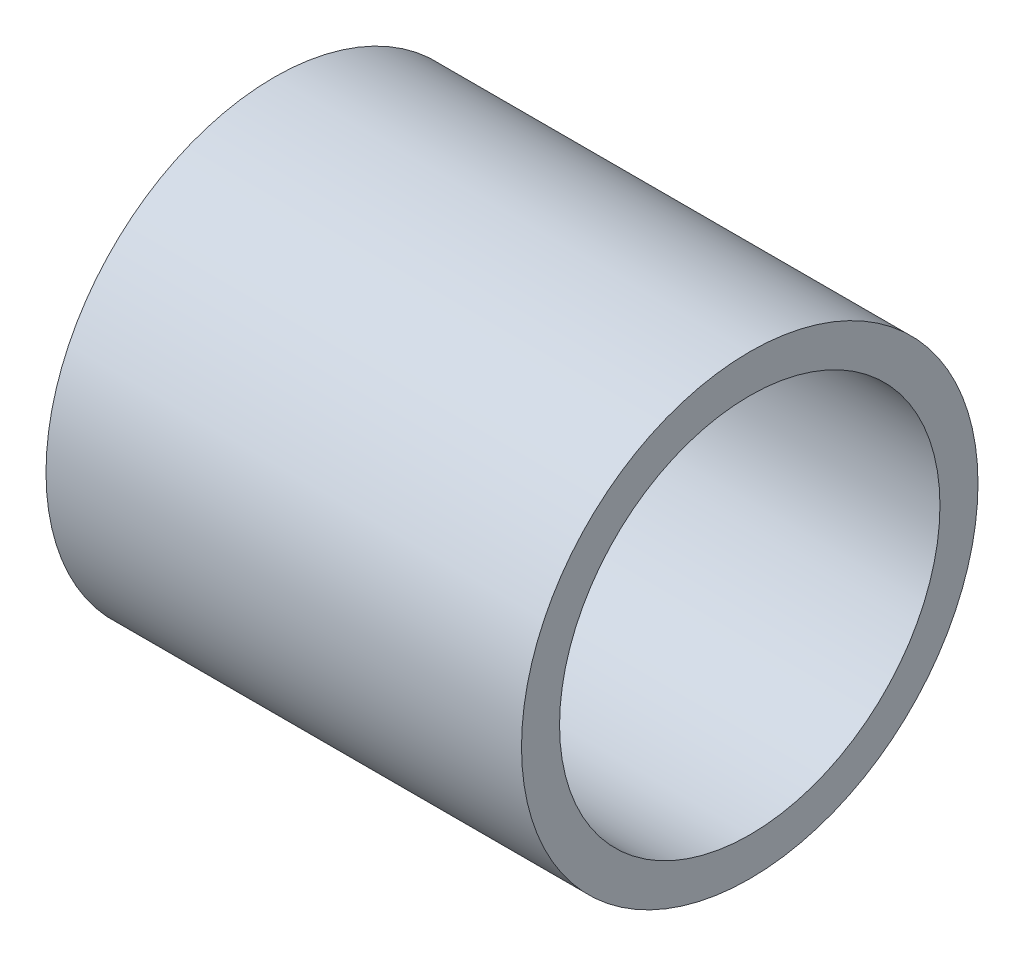
ISO-10303-21;
HEADER;
FILE_DESCRIPTION(('STEP AP214'),'2;1');
FILE_NAME('part.step','',(''),(''),'','','');
FILE_SCHEMA(('AUTOMOTIVE_DESIGN { 1 0 10303 214 1 1 1 1 }'));
ENDSEC;
DATA;
#1=APPLICATION_CONTEXT('core data for automotive mechanical design processes');
#2=APPLICATION_PROTOCOL_DEFINITION('international standard','automotive_design',2000,#1);
#3=PRODUCT_CONTEXT('',#1,'mechanical');
#4=PRODUCT('Part','Part','',(#3));
#5=PRODUCT_RELATED_PRODUCT_CATEGORY('part','',(#4));
#6=PRODUCT_DEFINITION_FORMATION('','',#4);
#7=PRODUCT_DEFINITION_CONTEXT('part definition',#1,'design');
#8=PRODUCT_DEFINITION('design','',#6,#7);
#9=PRODUCT_DEFINITION_SHAPE('','',#8);
#10=(LENGTH_UNIT() NAMED_UNIT(*) SI_UNIT(.MILLI.,.METRE.));
#11=(NAMED_UNIT(*) PLANE_ANGLE_UNIT() SI_UNIT($,.RADIAN.));
#12=(NAMED_UNIT(*) SI_UNIT($,.STERADIAN.) SOLID_ANGLE_UNIT());
#13=UNCERTAINTY_MEASURE_WITH_UNIT(LENGTH_MEASURE(1.E-05),#10,'distance_accuracy_value','');
#14=(GEOMETRIC_REPRESENTATION_CONTEXT(3) GLOBAL_UNCERTAINTY_ASSIGNED_CONTEXT((#13)) GLOBAL_UNIT_ASSIGNED_CONTEXT((#10,
#11,#12)) REPRESENTATION_CONTEXT('',''));
#15=CARTESIAN_POINT('',(0.,0.,0.));
#16=DIRECTION('',(0.,0.,1.));
#17=DIRECTION('',(1.,0.,0.));
#18=AXIS2_PLACEMENT_3D('',#15,#16,#17);
#19=CARTESIAN_POINT('',(0.,0.,0.));
#20=DIRECTION('',(1.,0.,0.));
#21=DIRECTION('',(0.,0.,1.));
#22=AXIS2_PLACEMENT_3D('',#19,#20,#21);
#23=PLANE('',#22);
#24=CARTESIAN_POINT('',(0.,0.,0.));
#25=DIRECTION('',(-1.,0.,0.));
#26=DIRECTION('',(0.,0.,1.));
#27=AXIS2_PLACEMENT_3D('',#24,#25,#26);
#28=CIRCLE('',#27,5.);
#29=CARTESIAN_POINT('',(0.,0.,5.));
#30=VERTEX_POINT('',#29);
#31=EDGE_CURVE('E8',#30,#30,#28,.T.);
#32=ORIENTED_EDGE('',*,*,#31,.F.);
#33=EDGE_LOOP('',(#32));
#34=FACE_BOUND('',#33,.T.);
#35=ADVANCED_FACE('F13',(#34),#23,.T.);
#36=CARTESIAN_POINT('',(0.,0.,0.));
#37=DIRECTION('',(-1.,0.,0.));
#38=DIRECTION('',(0.,0.,1.));
#39=AXIS2_PLACEMENT_3D('',#36,#37,#38);
#40=CYLINDRICAL_SURFACE('',#39,5.);
#41=ORIENTED_EDGE('',*,*,#31,.T.);
#42=EDGE_LOOP('',(#41));
#43=FACE_BOUND('',#42,.T.);
#44=CARTESIAN_POINT('',(11.,0.,0.));
#45=DIRECTION('',(-1.,0.,0.));
#46=DIRECTION('',(0.,0.,1.));
#47=AXIS2_PLACEMENT_3D('',#44,#45,#46);
#48=CIRCLE('',#47,5.);
#49=CARTESIAN_POINT('',(11.,0.,5.));
#50=VERTEX_POINT('',#49);
#51=EDGE_CURVE('E20',#50,#50,#48,.T.);
#52=ORIENTED_EDGE('',*,*,#51,.F.);
#53=EDGE_LOOP('',(#52));
#54=FACE_BOUND('',#53,.T.);
#55=ADVANCED_FACE('F57',(#43,#54),#40,.F.);
#56=CARTESIAN_POINT('',(11.,0.,0.));
#57=DIRECTION('',(1.,0.,0.));
#58=DIRECTION('',(0.,0.,1.));
#59=AXIS2_PLACEMENT_3D('',#56,#57,#58);
#60=PLANE('',#59);
#61=ORIENTED_EDGE('',*,*,#51,.T.);
#62=EDGE_LOOP('',(#61));
#63=FACE_BOUND('',#62,.T.);
#64=CARTESIAN_POINT('',(11.,0.,0.));
#65=DIRECTION('',(1.,0.,0.));
#66=DIRECTION('',(0.,0.,1.));
#67=AXIS2_PLACEMENT_3D('',#64,#65,#66);
#68=CIRCLE('',#67,6.);
#69=CARTESIAN_POINT('',(11.,0.,6.));
#70=VERTEX_POINT('',#69);
#71=EDGE_CURVE('E31',#70,#70,#68,.T.);
#72=ORIENTED_EDGE('',*,*,#71,.T.);
#73=EDGE_LOOP('',(#72));
#74=FACE_BOUND('',#73,.T.);
#75=ADVANCED_FACE('F41',(#63,#74),#60,.T.);
#76=CARTESIAN_POINT('',(34.25,4.71925298093923E-13,0.));
#77=DIRECTION('',(-1.,0.,0.));
#78=DIRECTION('',(0.,-1.,0.));
#79=AXIS2_PLACEMENT_3D('',#76,#77,#78);
#80=SPHERICAL_SURFACE('',#79,36.25);
#81=CARTESIAN_POINT('',(-1.5,0.,0.));
#82=DIRECTION('',(1.,0.,0.));
#83=DIRECTION('',(0.,0.,1.));
#84=AXIS2_PLACEMENT_3D('',#81,#82,#83);
#85=CIRCLE('',#84,6.);
#86=CARTESIAN_POINT('',(-1.5,0.,6.));
#87=VERTEX_POINT('',#86);
#88=EDGE_CURVE('E30',#87,#87,#85,.T.);
#89=ORIENTED_EDGE('',*,*,#88,.F.);
#90=EDGE_LOOP('',(#89));
#91=FACE_BOUND('',#90,.T.);
#92=ADVANCED_FACE('F44',(#91),#80,.T.);
#93=CARTESIAN_POINT('',(0.,0.,0.));
#94=DIRECTION('',(1.,0.,0.));
#95=DIRECTION('',(0.,0.,1.));
#96=AXIS2_PLACEMENT_3D('',#93,#94,#95);
#97=CYLINDRICAL_SURFACE('',#96,6.);
#98=ORIENTED_EDGE('',*,*,#88,.T.);
#99=EDGE_LOOP('',(#98));
#100=FACE_BOUND('',#99,.T.);
#101=ORIENTED_EDGE('',*,*,#71,.F.);
#102=EDGE_LOOP('',(#101));
#103=FACE_BOUND('',#102,.T.);
#104=ADVANCED_FACE('F43',(#100,#103),#97,.T.);
#105=CLOSED_SHELL('',(#35,#55,#75,#92,#104));
#106=MANIFOLD_SOLID_BREP('B1',#105);
#107=ADVANCED_BREP_SHAPE_REPRESENTATION('',(#18,#106),#14);
#108=SHAPE_DEFINITION_REPRESENTATION(#9,#107);
ENDSEC;
END-ISO-10303-21;
